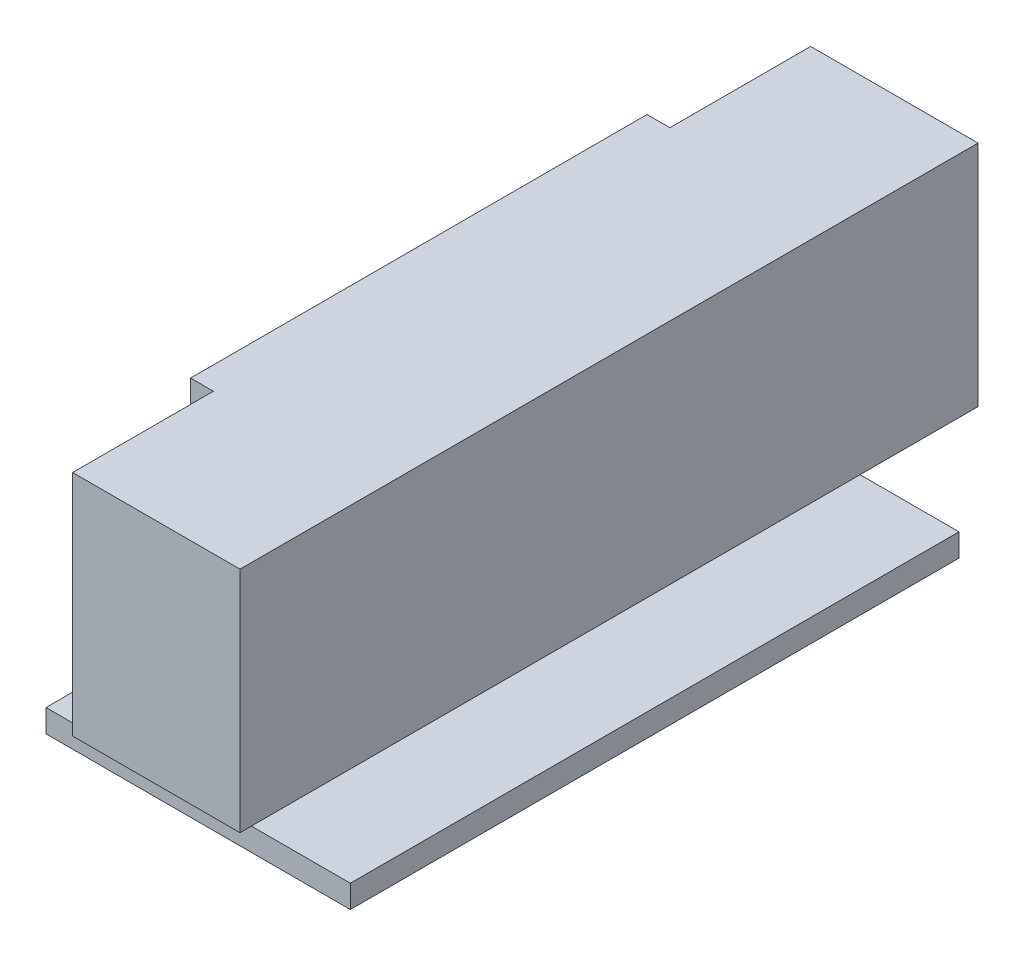
ISO-10303-21;
HEADER;
FILE_DESCRIPTION(('STEP AP214'),'2;1');
FILE_NAME('part.step','',(''),(''),'','','');
FILE_SCHEMA(('AUTOMOTIVE_DESIGN { 1 0 10303 214 1 1 1 1 }'));
ENDSEC;
DATA;
#1=APPLICATION_CONTEXT('core data for automotive mechanical design processes');
#2=APPLICATION_PROTOCOL_DEFINITION('international standard','automotive_design',2000,#1);
#3=PRODUCT_CONTEXT('',#1,'mechanical');
#4=PRODUCT('Part','Part','',(#3));
#5=PRODUCT_RELATED_PRODUCT_CATEGORY('part','',(#4));
#6=PRODUCT_DEFINITION_FORMATION('','',#4);
#7=PRODUCT_DEFINITION_CONTEXT('part definition',#1,'design');
#8=PRODUCT_DEFINITION('design','',#6,#7);
#9=PRODUCT_DEFINITION_SHAPE('','',#8);
#10=(LENGTH_UNIT() NAMED_UNIT(*) SI_UNIT(.MILLI.,.METRE.));
#11=(NAMED_UNIT(*) PLANE_ANGLE_UNIT() SI_UNIT($,.RADIAN.));
#12=(NAMED_UNIT(*) SI_UNIT($,.STERADIAN.) SOLID_ANGLE_UNIT());
#13=UNCERTAINTY_MEASURE_WITH_UNIT(LENGTH_MEASURE(1.E-05),#10,'distance_accuracy_value','');
#14=(GEOMETRIC_REPRESENTATION_CONTEXT(3) GLOBAL_UNCERTAINTY_ASSIGNED_CONTEXT((#13)) GLOBAL_UNIT_ASSIGNED_CONTEXT((#10,
#11,#12)) REPRESENTATION_CONTEXT('',''));
#15=CARTESIAN_POINT('',(0.,0.,0.));
#16=DIRECTION('',(0.,0.,1.));
#17=DIRECTION('',(1.,0.,0.));
#18=AXIS2_PLACEMENT_3D('',#15,#16,#17);
#19=CARTESIAN_POINT('',(-11.,0.,30.));
#20=DIRECTION('',(-1.,0.,0.));
#21=DIRECTION('',(0.,0.,1.));
#22=AXIS2_PLACEMENT_3D('',#19,#20,#21);
#23=PLANE('',#22);
#24=DIRECTION('',(0.,0.,-1.));
#25=VECTOR('',#24,1.);
#26=CARTESIAN_POINT('',(-11.,10.,48.5));
#27=LINE('',#26,#25);
#28=CARTESIAN_POINT('',(-11.,10.,30.));
#29=VERTEX_POINT('',#28);
#30=CARTESIAN_POINT('',(-11.,10.,-30.));
#31=VERTEX_POINT('',#30);
#32=EDGE_CURVE('E53',#29,#31,#27,.T.);
#33=ORIENTED_EDGE('',*,*,#32,.F.);
#34=DIRECTION('',(0.,1.,0.));
#35=VECTOR('',#34,1.);
#36=CARTESIAN_POINT('',(-11.,0.,30.));
#37=LINE('',#36,#35);
#38=CARTESIAN_POINT('',(-11.,3.,30.));
#39=VERTEX_POINT('',#38);
#40=EDGE_CURVE('E200',#39,#29,#37,.T.);
#41=ORIENTED_EDGE('',*,*,#40,.F.);
#42=DIRECTION('',(0.,0.,-1.));
#43=VECTOR('',#42,1.);
#44=CARTESIAN_POINT('',(-11.,3.,40.));
#45=LINE('',#44,#43);
#46=CARTESIAN_POINT('',(-11.,3.,-30.));
#47=VERTEX_POINT('',#46);
#48=EDGE_CURVE('E245',#39,#47,#45,.T.);
#49=ORIENTED_EDGE('',*,*,#48,.T.);
#50=DIRECTION('',(0.,1.,0.));
#51=VECTOR('',#50,1.);
#52=CARTESIAN_POINT('',(-11.,0.,-30.));
#53=LINE('',#52,#51);
#54=EDGE_CURVE('E202',#47,#31,#53,.T.);
#55=ORIENTED_EDGE('',*,*,#54,.T.);
#56=EDGE_LOOP('',(#33,#41,#49,#55));
#57=FACE_BOUND('',#56,.T.);
#58=ADVANCED_FACE('F39',(#57),#23,.F.);
#59=CARTESIAN_POINT('',(-23.,3.,40.));
#60=DIRECTION('',(1.,0.,0.));
#61=DIRECTION('',(0.,0.,-1.));
#62=AXIS2_PLACEMENT_3D('',#59,#60,#61);
#63=PLANE('',#62);
#64=DIRECTION('',(0.,-1.,0.));
#65=VECTOR('',#64,1.);
#66=CARTESIAN_POINT('',(-23.,3.,-40.));
#67=LINE('',#66,#65);
#68=CARTESIAN_POINT('',(-23.,3.,-40.));
#69=VERTEX_POINT('',#68);
#70=CARTESIAN_POINT('',(-23.,0.,-40.));
#71=VERTEX_POINT('',#70);
#72=EDGE_CURVE('E203',#69,#71,#67,.T.);
#73=ORIENTED_EDGE('',*,*,#72,.T.);
#74=DIRECTION('',(0.,0.,-1.));
#75=VECTOR('',#74,1.);
#76=CARTESIAN_POINT('',(-23.,0.,40.));
#77=LINE('',#76,#75);
#78=CARTESIAN_POINT('',(-23.,0.,40.));
#79=VERTEX_POINT('',#78);
#80=EDGE_CURVE('E237',#79,#71,#77,.T.);
#81=ORIENTED_EDGE('',*,*,#80,.F.);
#82=DIRECTION('',(0.,-1.,0.));
#83=VECTOR('',#82,1.);
#84=CARTESIAN_POINT('',(-23.,3.,40.));
#85=LINE('',#84,#83);
#86=CARTESIAN_POINT('',(-23.,3.,40.));
#87=VERTEX_POINT('',#86);
#88=EDGE_CURVE('E209',#87,#79,#85,.T.);
#89=ORIENTED_EDGE('',*,*,#88,.F.);
#90=DIRECTION('',(0.,0.,-1.));
#91=VECTOR('',#90,1.);
#92=CARTESIAN_POINT('',(-23.,3.,40.));
#93=LINE('',#92,#91);
#94=EDGE_CURVE('E219',#87,#69,#93,.T.);
#95=ORIENTED_EDGE('',*,*,#94,.T.);
#96=EDGE_LOOP('',(#73,#81,#89,#95));
#97=FACE_BOUND('',#96,.T.);
#98=ADVANCED_FACE('F41',(#97),#63,.F.);
#99=CARTESIAN_POINT('',(-23.,0.,40.));
#100=DIRECTION('',(0.,1.,0.));
#101=DIRECTION('',(0.,0.,1.));
#102=AXIS2_PLACEMENT_3D('',#99,#100,#101);
#103=PLANE('',#102);
#104=DIRECTION('',(1.,0.,0.));
#105=VECTOR('',#104,1.);
#106=CARTESIAN_POINT('',(-23.,0.,-40.));
#107=LINE('',#106,#105);
#108=CARTESIAN_POINT('',(17.,0.,-40.));
#109=VERTEX_POINT('',#108);
#110=EDGE_CURVE('E224',#71,#109,#107,.T.);
#111=ORIENTED_EDGE('',*,*,#110,.T.);
#112=DIRECTION('',(0.,0.,-1.));
#113=VECTOR('',#112,1.);
#114=CARTESIAN_POINT('',(17.,0.,40.));
#115=LINE('',#114,#113);
#116=CARTESIAN_POINT('',(17.,0.,40.));
#117=VERTEX_POINT('',#116);
#118=EDGE_CURVE('E233',#117,#109,#115,.T.);
#119=ORIENTED_EDGE('',*,*,#118,.F.);
#120=DIRECTION('',(1.,0.,0.));
#121=VECTOR('',#120,1.);
#122=CARTESIAN_POINT('',(-23.,0.,40.));
#123=LINE('',#122,#121);
#124=EDGE_CURVE('E213',#79,#117,#123,.T.);
#125=ORIENTED_EDGE('',*,*,#124,.F.);
#126=ORIENTED_EDGE('',*,*,#80,.T.);
#127=EDGE_LOOP('',(#111,#119,#125,#126));
#128=FACE_BOUND('',#127,.T.);
#129=ADVANCED_FACE('F272',(#128),#103,.F.);
#130=CARTESIAN_POINT('',(17.,0.,40.));
#131=DIRECTION('',(-1.,0.,0.));
#132=DIRECTION('',(0.,0.,1.));
#133=AXIS2_PLACEMENT_3D('',#130,#131,#132);
#134=PLANE('',#133);
#135=DIRECTION('',(0.,1.,0.));
#136=VECTOR('',#135,1.);
#137=CARTESIAN_POINT('',(17.,0.,-40.));
#138=LINE('',#137,#136);
#139=CARTESIAN_POINT('',(17.,3.,-40.));
#140=VERTEX_POINT('',#139);
#141=EDGE_CURVE('E223',#109,#140,#138,.T.);
#142=ORIENTED_EDGE('',*,*,#141,.T.);
#143=DIRECTION('',(0.,0.,-1.));
#144=VECTOR('',#143,1.);
#145=CARTESIAN_POINT('',(17.,3.,40.));
#146=LINE('',#145,#144);
#147=CARTESIAN_POINT('',(17.,3.,40.));
#148=VERTEX_POINT('',#147);
#149=EDGE_CURVE('E228',#148,#140,#146,.T.);
#150=ORIENTED_EDGE('',*,*,#149,.F.);
#151=DIRECTION('',(0.,1.,0.));
#152=VECTOR('',#151,1.);
#153=CARTESIAN_POINT('',(17.,0.,40.));
#154=LINE('',#153,#152);
#155=EDGE_CURVE('E216',#117,#148,#154,.T.);
#156=ORIENTED_EDGE('',*,*,#155,.F.);
#157=ORIENTED_EDGE('',*,*,#118,.T.);
#158=EDGE_LOOP('',(#142,#150,#156,#157));
#159=FACE_BOUND('',#158,.T.);
#160=ADVANCED_FACE('F286',(#159),#134,.F.);
#161=CARTESIAN_POINT('',(17.,3.,40.));
#162=DIRECTION('',(0.,-1.,0.));
#163=DIRECTION('',(0.,0.,-1.));
#164=AXIS2_PLACEMENT_3D('',#161,#162,#163);
#165=PLANE('',#164);
#166=ORIENTED_EDGE('',*,*,#48,.F.);
#167=DIRECTION('',(-1.,0.,0.));
#168=VECTOR('',#167,1.);
#169=CARTESIAN_POINT('',(17.,3.,30.));
#170=LINE('',#169,#168);
#171=CARTESIAN_POINT('',(-14.,3.,30.));
#172=VERTEX_POINT('',#171);
#173=EDGE_CURVE('E11',#39,#172,#170,.T.);
#174=ORIENTED_EDGE('',*,*,#173,.T.);
#175=DIRECTION('',(0.,0.,1.));
#176=VECTOR('',#175,1.);
#177=CARTESIAN_POINT('',(-14.,3.,40.));
#178=LINE('',#177,#176);
#179=CARTESIAN_POINT('',(-14.,3.,-30.));
#180=VERTEX_POINT('',#179);
#181=EDGE_CURVE('E50',#180,#172,#178,.T.);
#182=ORIENTED_EDGE('',*,*,#181,.F.);
#183=DIRECTION('',(-1.,0.,0.));
#184=VECTOR('',#183,1.);
#185=CARTESIAN_POINT('',(17.,3.,-30.));
#186=LINE('',#185,#184);
#187=EDGE_CURVE('E239',#47,#180,#186,.T.);
#188=ORIENTED_EDGE('',*,*,#187,.F.);
#189=EDGE_LOOP('',(#166,#174,#182,#188));
#190=FACE_BOUND('',#189,.T.);
#191=DIRECTION('',(-1.,0.,0.));
#192=VECTOR('',#191,1.);
#193=CARTESIAN_POINT('',(17.,3.,-40.));
#194=LINE('',#193,#192);
#195=EDGE_CURVE('E212',#140,#69,#194,.T.);
#196=ORIENTED_EDGE('',*,*,#195,.T.);
#197=ORIENTED_EDGE('',*,*,#94,.F.);
#198=DIRECTION('',(-1.,0.,0.));
#199=VECTOR('',#198,1.);
#200=CARTESIAN_POINT('',(17.,3.,40.));
#201=LINE('',#200,#199);
#202=EDGE_CURVE('E217',#148,#87,#201,.T.);
#203=ORIENTED_EDGE('',*,*,#202,.F.);
#204=ORIENTED_EDGE('',*,*,#149,.T.);
#205=EDGE_LOOP('',(#196,#197,#203,#204));
#206=FACE_BOUND('',#205,.T.);
#207=ADVANCED_FACE('F284',(#190,#206),#165,.F.);
#208=CARTESIAN_POINT('',(0.,0.,40.));
#209=DIRECTION('',(0.,0.,1.));
#210=DIRECTION('',(1.,0.,0.));
#211=AXIS2_PLACEMENT_3D('',#208,#209,#210);
#212=PLANE('',#211);
#213=ORIENTED_EDGE('',*,*,#88,.T.);
#214=ORIENTED_EDGE('',*,*,#124,.T.);
#215=ORIENTED_EDGE('',*,*,#155,.T.);
#216=ORIENTED_EDGE('',*,*,#202,.T.);
#217=EDGE_LOOP('',(#213,#214,#215,#216));
#218=FACE_BOUND('',#217,.T.);
#219=ADVANCED_FACE('F278',(#218),#212,.T.);
#220=CARTESIAN_POINT('',(0.,0.,-40.));
#221=DIRECTION('',(0.,0.,1.));
#222=DIRECTION('',(1.,0.,0.));
#223=AXIS2_PLACEMENT_3D('',#220,#221,#222);
#224=PLANE('',#223);
#225=ORIENTED_EDGE('',*,*,#72,.F.);
#226=ORIENTED_EDGE('',*,*,#195,.F.);
#227=ORIENTED_EDGE('',*,*,#141,.F.);
#228=ORIENTED_EDGE('',*,*,#110,.F.);
#229=EDGE_LOOP('',(#225,#226,#227,#228));
#230=FACE_BOUND('',#229,.T.);
#231=ADVANCED_FACE('F276',(#230),#224,.F.);
#232=CARTESIAN_POINT('',(-14.,40.,30.));
#233=DIRECTION('',(1.,0.,0.));
#234=DIRECTION('',(0.,0.,-1.));
#235=AXIS2_PLACEMENT_3D('',#232,#233,#234);
#236=PLANE('',#235);
#237=DIRECTION('',(0.,-1.,0.));
#238=VECTOR('',#237,1.);
#239=CARTESIAN_POINT('',(-14.,40.,-30.));
#240=LINE('',#239,#238);
#241=CARTESIAN_POINT('',(-14.,40.,-30.));
#242=VERTEX_POINT('',#241);
#243=EDGE_CURVE('E160',#242,#180,#240,.T.);
#244=ORIENTED_EDGE('',*,*,#243,.T.);
#245=ORIENTED_EDGE('',*,*,#181,.T.);
#246=DIRECTION('',(0.,-1.,0.));
#247=VECTOR('',#246,1.);
#248=CARTESIAN_POINT('',(-14.,40.,30.));
#249=LINE('',#248,#247);
#250=CARTESIAN_POINT('',(-14.,40.,30.));
#251=VERTEX_POINT('',#250);
#252=EDGE_CURVE('E208',#251,#172,#249,.T.);
#253=ORIENTED_EDGE('',*,*,#252,.F.);
#254=DIRECTION('',(0.,0.,-1.));
#255=VECTOR('',#254,1.);
#256=CARTESIAN_POINT('',(-14.,40.,30.));
#257=LINE('',#256,#255);
#258=EDGE_CURVE('E191',#251,#242,#257,.T.);
#259=ORIENTED_EDGE('',*,*,#258,.T.);
#260=EDGE_LOOP('',(#244,#245,#253,#259));
#261=FACE_BOUND('',#260,.T.);
#262=ADVANCED_FACE('F243',(#261),#236,.F.);
#263=CARTESIAN_POINT('',(0.,0.,30.));
#264=DIRECTION('',(0.,0.,1.));
#265=DIRECTION('',(1.,0.,0.));
#266=AXIS2_PLACEMENT_3D('',#263,#264,#265);
#267=PLANE('',#266);
#268=ORIENTED_EDGE('',*,*,#173,.F.);
#269=ORIENTED_EDGE('',*,*,#40,.T.);
#270=CARTESIAN_POINT('',(-11.,40.,30.));
#271=VERTEX_POINT('',#270);
#272=EDGE_CURVE('E156',#29,#271,#37,.T.);
#273=ORIENTED_EDGE('',*,*,#272,.T.);
#274=DIRECTION('',(-1.,0.,0.));
#275=VECTOR('',#274,1.);
#276=CARTESIAN_POINT('',(-11.,40.,30.));
#277=LINE('',#276,#275);
#278=EDGE_CURVE('E193',#271,#251,#277,.T.);
#279=ORIENTED_EDGE('',*,*,#278,.T.);
#280=ORIENTED_EDGE('',*,*,#252,.T.);
#281=EDGE_LOOP('',(#268,#269,#273,#279,#280));
#282=FACE_BOUND('',#281,.T.);
#283=ADVANCED_FACE('F250',(#282),#267,.T.);
#284=CARTESIAN_POINT('',(0.,0.,-30.));
#285=DIRECTION('',(0.,0.,1.));
#286=DIRECTION('',(1.,0.,0.));
#287=AXIS2_PLACEMENT_3D('',#284,#285,#286);
#288=PLANE('',#287);
#289=ORIENTED_EDGE('',*,*,#54,.F.);
#290=ORIENTED_EDGE('',*,*,#187,.T.);
#291=ORIENTED_EDGE('',*,*,#243,.F.);
#292=DIRECTION('',(-1.,0.,0.));
#293=VECTOR('',#292,1.);
#294=CARTESIAN_POINT('',(-11.,40.,-30.));
#295=LINE('',#294,#293);
#296=CARTESIAN_POINT('',(-11.,40.,-30.));
#297=VERTEX_POINT('',#296);
#298=EDGE_CURVE('E210',#297,#242,#295,.T.);
#299=ORIENTED_EDGE('',*,*,#298,.F.);
#300=EDGE_CURVE('E161',#31,#297,#53,.T.);
#301=ORIENTED_EDGE('',*,*,#300,.F.);
#302=EDGE_LOOP('',(#289,#290,#291,#299,#301));
#303=FACE_BOUND('',#302,.T.);
#304=ADVANCED_FACE('F253',(#303),#288,.F.);
#305=CARTESIAN_POINT('',(-11.,40.,30.));
#306=DIRECTION('',(0.,-1.,0.));
#307=DIRECTION('',(0.,0.,-1.));
#308=AXIS2_PLACEMENT_3D('',#305,#306,#307);
#309=PLANE('',#308);
#310=ORIENTED_EDGE('',*,*,#298,.T.);
#311=ORIENTED_EDGE('',*,*,#258,.F.);
#312=ORIENTED_EDGE('',*,*,#278,.F.);
#313=DIRECTION('',(0.,0.,-1.));
#314=VECTOR('',#313,1.);
#315=CARTESIAN_POINT('',(-11.,40.,48.5));
#316=LINE('',#315,#314);
#317=CARTESIAN_POINT('',(-11.,40.,48.5));
#318=VERTEX_POINT('',#317);
#319=EDGE_CURVE('E172',#318,#271,#316,.T.);
#320=ORIENTED_EDGE('',*,*,#319,.F.);
#321=DIRECTION('',(-1.,0.,0.));
#322=VECTOR('',#321,1.);
#323=CARTESIAN_POINT('',(11.,40.,48.5));
#324=LINE('',#323,#322);
#325=CARTESIAN_POINT('',(11.,40.,48.5));
#326=VERTEX_POINT('',#325);
#327=EDGE_CURVE('E146',#326,#318,#324,.T.);
#328=ORIENTED_EDGE('',*,*,#327,.F.);
#329=DIRECTION('',(0.,0.,-1.));
#330=VECTOR('',#329,1.);
#331=CARTESIAN_POINT('',(11.,40.,48.5));
#332=LINE('',#331,#330);
#333=CARTESIAN_POINT('',(11.,40.,-48.5));
#334=VERTEX_POINT('',#333);
#335=EDGE_CURVE('E170',#326,#334,#332,.T.);
#336=ORIENTED_EDGE('',*,*,#335,.T.);
#337=DIRECTION('',(-1.,0.,0.));
#338=VECTOR('',#337,1.);
#339=CARTESIAN_POINT('',(11.,40.,-48.5));
#340=LINE('',#339,#338);
#341=CARTESIAN_POINT('',(-11.,40.,-48.5));
#342=VERTEX_POINT('',#341);
#343=EDGE_CURVE('E155',#334,#342,#340,.T.);
#344=ORIENTED_EDGE('',*,*,#343,.T.);
#345=EDGE_CURVE('E173',#297,#342,#316,.T.);
#346=ORIENTED_EDGE('',*,*,#345,.F.);
#347=EDGE_LOOP('',(#310,#311,#312,#320,#328,#336,#344,#346));
#348=FACE_BOUND('',#347,.T.);
#349=ADVANCED_FACE('F188',(#348),#309,.F.);
#350=CARTESIAN_POINT('',(-11.,40.,48.5));
#351=DIRECTION('',(1.,0.,0.));
#352=DIRECTION('',(0.,0.,-1.));
#353=AXIS2_PLACEMENT_3D('',#350,#351,#352);
#354=PLANE('',#353);
#355=CARTESIAN_POINT('',(-11.,10.,-48.5));
#356=VERTEX_POINT('',#355);
#357=EDGE_CURVE('E157',#31,#356,#27,.T.);
#358=ORIENTED_EDGE('',*,*,#357,.F.);
#359=ORIENTED_EDGE('',*,*,#300,.T.);
#360=ORIENTED_EDGE('',*,*,#345,.T.);
#361=DIRECTION('',(0.,-1.,0.));
#362=VECTOR('',#361,1.);
#363=CARTESIAN_POINT('',(-11.,40.,-48.5));
#364=LINE('',#363,#362);
#365=EDGE_CURVE('E185',#342,#356,#364,.T.);
#366=ORIENTED_EDGE('',*,*,#365,.T.);
#367=EDGE_LOOP('',(#358,#359,#360,#366));
#368=FACE_BOUND('',#367,.T.);
#369=ADVANCED_FACE('F254',(#368),#354,.F.);
#370=ORIENTED_EDGE('',*,*,#272,.F.);
#371=CARTESIAN_POINT('',(-11.,10.,48.5));
#372=VERTEX_POINT('',#371);
#373=EDGE_CURVE('E140',#372,#29,#27,.T.);
#374=ORIENTED_EDGE('',*,*,#373,.F.);
#375=DIRECTION('',(0.,-1.,0.));
#376=VECTOR('',#375,1.);
#377=CARTESIAN_POINT('',(-11.,40.,48.5));
#378=LINE('',#377,#376);
#379=EDGE_CURVE('E141',#318,#372,#378,.T.);
#380=ORIENTED_EDGE('',*,*,#379,.F.);
#381=ORIENTED_EDGE('',*,*,#319,.T.);
#382=EDGE_LOOP('',(#370,#374,#380,#381));
#383=FACE_BOUND('',#382,.T.);
#384=ADVANCED_FACE('F154',(#383),#354,.F.);
#385=CARTESIAN_POINT('',(-11.,10.,48.5));
#386=DIRECTION('',(0.,1.,0.));
#387=DIRECTION('',(0.,0.,1.));
#388=AXIS2_PLACEMENT_3D('',#385,#386,#387);
#389=PLANE('',#388);
#390=DIRECTION('',(1.,0.,0.));
#391=VECTOR('',#390,1.);
#392=CARTESIAN_POINT('',(-11.,10.,-48.5));
#393=LINE('',#392,#391);
#394=CARTESIAN_POINT('',(11.,10.,-48.5));
#395=VERTEX_POINT('',#394);
#396=EDGE_CURVE('E176',#356,#395,#393,.T.);
#397=ORIENTED_EDGE('',*,*,#396,.T.);
#398=DIRECTION('',(0.,0.,-1.));
#399=VECTOR('',#398,1.);
#400=CARTESIAN_POINT('',(11.,10.,48.5));
#401=LINE('',#400,#399);
#402=CARTESIAN_POINT('',(11.,10.,48.5));
#403=VERTEX_POINT('',#402);
#404=EDGE_CURVE('E139',#403,#395,#401,.T.);
#405=ORIENTED_EDGE('',*,*,#404,.F.);
#406=DIRECTION('',(1.,0.,0.));
#407=VECTOR('',#406,1.);
#408=CARTESIAN_POINT('',(-11.,10.,48.5));
#409=LINE('',#408,#407);
#410=EDGE_CURVE('E134',#372,#403,#409,.T.);
#411=ORIENTED_EDGE('',*,*,#410,.F.);
#412=ORIENTED_EDGE('',*,*,#373,.T.);
#413=ORIENTED_EDGE('',*,*,#32,.T.);
#414=ORIENTED_EDGE('',*,*,#357,.T.);
#415=EDGE_LOOP('',(#397,#405,#411,#412,#413,#414));
#416=FACE_BOUND('',#415,.T.);
#417=ADVANCED_FACE('F133',(#416),#389,.F.);
#418=CARTESIAN_POINT('',(11.,10.,48.5));
#419=DIRECTION('',(-1.,0.,0.));
#420=DIRECTION('',(0.,0.,1.));
#421=AXIS2_PLACEMENT_3D('',#418,#419,#420);
#422=PLANE('',#421);
#423=DIRECTION('',(0.,1.,0.));
#424=VECTOR('',#423,1.);
#425=CARTESIAN_POINT('',(11.,10.,-48.5));
#426=LINE('',#425,#424);
#427=EDGE_CURVE('E178',#395,#334,#426,.T.);
#428=ORIENTED_EDGE('',*,*,#427,.T.);
#429=ORIENTED_EDGE('',*,*,#335,.F.);
#430=DIRECTION('',(0.,1.,0.));
#431=VECTOR('',#430,1.);
#432=CARTESIAN_POINT('',(11.,10.,48.5));
#433=LINE('',#432,#431);
#434=EDGE_CURVE('E142',#403,#326,#433,.T.);
#435=ORIENTED_EDGE('',*,*,#434,.F.);
#436=ORIENTED_EDGE('',*,*,#404,.T.);
#437=EDGE_LOOP('',(#428,#429,#435,#436));
#438=FACE_BOUND('',#437,.T.);
#439=ADVANCED_FACE('F190',(#438),#422,.F.);
#440=CARTESIAN_POINT('',(0.,0.,48.5));
#441=DIRECTION('',(0.,0.,1.));
#442=DIRECTION('',(1.,0.,0.));
#443=AXIS2_PLACEMENT_3D('',#440,#441,#442);
#444=PLANE('',#443);
#445=ORIENTED_EDGE('',*,*,#379,.T.);
#446=ORIENTED_EDGE('',*,*,#410,.T.);
#447=ORIENTED_EDGE('',*,*,#434,.T.);
#448=ORIENTED_EDGE('',*,*,#327,.T.);
#449=EDGE_LOOP('',(#445,#446,#447,#448));
#450=FACE_BOUND('',#449,.T.);
#451=ADVANCED_FACE('F148',(#450),#444,.T.);
#452=CARTESIAN_POINT('',(0.,0.,-48.5));
#453=DIRECTION('',(0.,0.,1.));
#454=DIRECTION('',(1.,0.,0.));
#455=AXIS2_PLACEMENT_3D('',#452,#453,#454);
#456=PLANE('',#455);
#457=ORIENTED_EDGE('',*,*,#365,.F.);
#458=ORIENTED_EDGE('',*,*,#343,.F.);
#459=ORIENTED_EDGE('',*,*,#427,.F.);
#460=ORIENTED_EDGE('',*,*,#396,.F.);
#461=EDGE_LOOP('',(#457,#458,#459,#460));
#462=FACE_BOUND('',#461,.T.);
#463=ADVANCED_FACE('F256',(#462),#456,.F.);
#464=CLOSED_SHELL('',(#58,#98,#129,#160,#207,#219,#231,#262,#283,#304,#349,#369,#384,#417,#439,
#451,#463));
#465=MANIFOLD_SOLID_BREP('B2',#464);
#466=ADVANCED_BREP_SHAPE_REPRESENTATION('',(#18,#465),#14);
#467=SHAPE_DEFINITION_REPRESENTATION(#9,#466);
ENDSEC;
END-ISO-10303-21;
